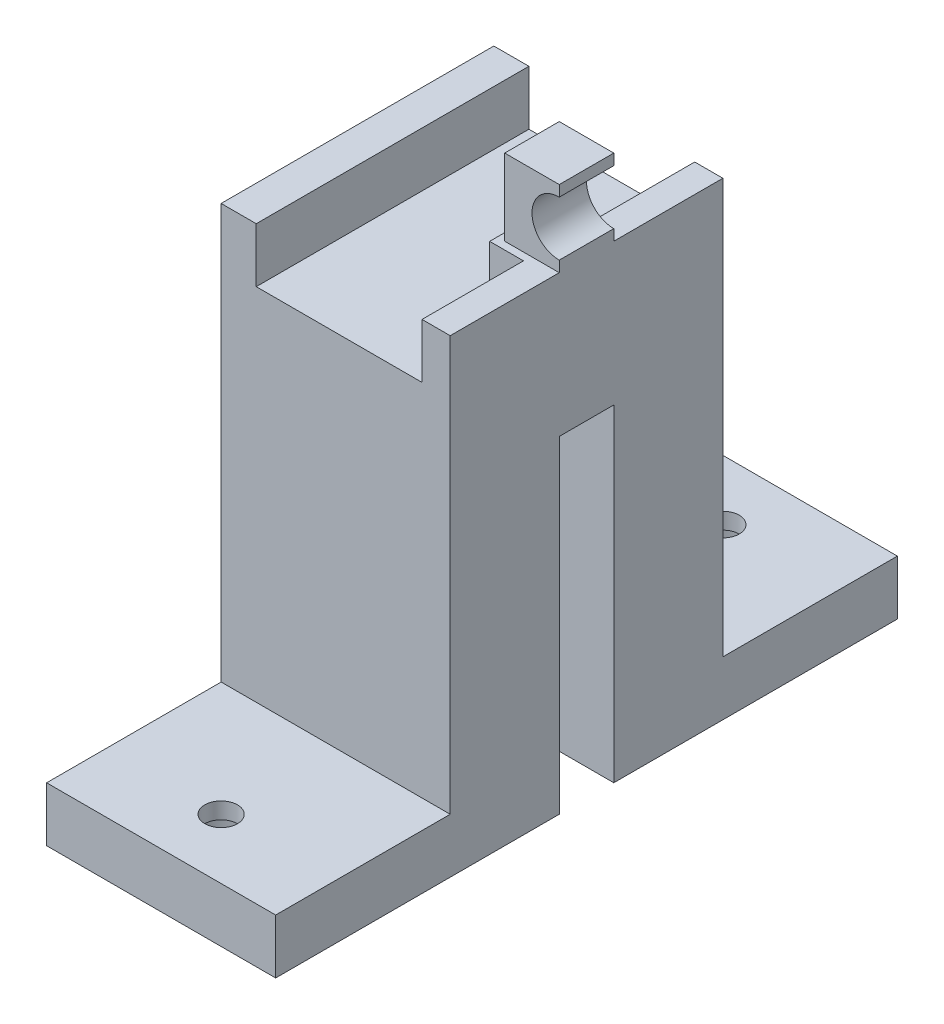
ISO-10303-21;
HEADER;
FILE_DESCRIPTION(('STEP AP214'),'2;1');
FILE_NAME('part.step','',(''),(''),'','','');
FILE_SCHEMA(('AUTOMOTIVE_DESIGN { 1 0 10303 214 1 1 1 1 }'));
ENDSEC;
DATA;
#1=APPLICATION_CONTEXT('core data for automotive mechanical design processes');
#2=APPLICATION_PROTOCOL_DEFINITION('international standard','automotive_design',2000,#1);
#3=PRODUCT_CONTEXT('',#1,'mechanical');
#4=PRODUCT('Part','Part','',(#3));
#5=PRODUCT_RELATED_PRODUCT_CATEGORY('part','',(#4));
#6=PRODUCT_DEFINITION_FORMATION('','',#4);
#7=PRODUCT_DEFINITION_CONTEXT('part definition',#1,'design');
#8=PRODUCT_DEFINITION('design','',#6,#7);
#9=PRODUCT_DEFINITION_SHAPE('','',#8);
#10=(LENGTH_UNIT() NAMED_UNIT(*) SI_UNIT(.MILLI.,.METRE.));
#11=(NAMED_UNIT(*) PLANE_ANGLE_UNIT() SI_UNIT($,.RADIAN.));
#12=(NAMED_UNIT(*) SI_UNIT($,.STERADIAN.) SOLID_ANGLE_UNIT());
#13=UNCERTAINTY_MEASURE_WITH_UNIT(LENGTH_MEASURE(1.E-05),#10,'distance_accuracy_value','');
#14=(GEOMETRIC_REPRESENTATION_CONTEXT(3) GLOBAL_UNCERTAINTY_ASSIGNED_CONTEXT((#13)) GLOBAL_UNIT_ASSIGNED_CONTEXT((#10,
#11,#12)) REPRESENTATION_CONTEXT('',''));
#15=CARTESIAN_POINT('',(0.,0.,0.));
#16=DIRECTION('',(0.,0.,1.));
#17=DIRECTION('',(1.,0.,0.));
#18=AXIS2_PLACEMENT_3D('',#15,#16,#17);
#19=CARTESIAN_POINT('',(-9.,43.,-2.5));
#20=DIRECTION('',(0.,-1.,0.));
#21=DIRECTION('',(0.,0.,-1.));
#22=AXIS2_PLACEMENT_3D('',#19,#20,#21);
#23=PLANE('',#22);
#24=DIRECTION('',(1.,0.,0.));
#25=VECTOR('',#24,1.);
#26=CARTESIAN_POINT('',(0.,43.,12.5));
#27=LINE('',#26,#25);
#28=CARTESIAN_POINT('',(0.,43.,12.5));
#29=VERTEX_POINT('',#28);
#30=CARTESIAN_POINT('',(3.21849819240387,43.,12.5));
#31=VERTEX_POINT('',#30);
#32=EDGE_CURVE('E353',#29,#31,#27,.T.);
#33=ORIENTED_EDGE('',*,*,#32,.T.);
#34=DIRECTION('',(0.,0.,1.));
#35=VECTOR('',#34,1.);
#36=CARTESIAN_POINT('',(3.21849819240387,43.,-12.5));
#37=LINE('',#36,#35);
#38=CARTESIAN_POINT('',(3.21849819240387,43.,-12.5));
#39=VERTEX_POINT('',#38);
#40=EDGE_CURVE('E525',#39,#31,#37,.T.);
#41=ORIENTED_EDGE('',*,*,#40,.F.);
#42=DIRECTION('',(1.,0.,0.));
#43=VECTOR('',#42,1.);
#44=CARTESIAN_POINT('',(0.,43.,-12.5));
#45=LINE('',#44,#43);
#46=CARTESIAN_POINT('',(0.,43.,-12.5));
#47=VERTEX_POINT('',#46);
#48=EDGE_CURVE('E349',#47,#39,#45,.T.);
#49=ORIENTED_EDGE('',*,*,#48,.F.);
#50=DIRECTION('',(0.,0.,1.));
#51=VECTOR('',#50,1.);
#52=CARTESIAN_POINT('',(0.,43.,8.5));
#53=LINE('',#52,#51);
#54=EDGE_CURVE('E385',#47,#29,#53,.T.);
#55=ORIENTED_EDGE('',*,*,#54,.T.);
#56=EDGE_LOOP('',(#33,#41,#49,#55));
#57=FACE_BOUND('',#56,.T.);
#58=ADVANCED_FACE('F59',(#57),#23,.F.);
#59=CARTESIAN_POINT('',(10.5,-10.,23.));
#60=DIRECTION('',(0.,1.,0.));
#61=DIRECTION('',(0.,0.,1.));
#62=AXIS2_PLACEMENT_3D('',#59,#60,#61);
#63=CYLINDRICAL_SURFACE('',#62,1.5);
#64=CARTESIAN_POINT('',(10.5,5.,23.));
#65=DIRECTION('',(0.,-1.,0.));
#66=DIRECTION('',(0.,0.,-1.));
#67=AXIS2_PLACEMENT_3D('',#64,#65,#66);
#68=CIRCLE('',#67,1.5);
#69=CARTESIAN_POINT('',(10.5,5.,21.5));
#70=VERTEX_POINT('',#69);
#71=EDGE_CURVE('E292',#70,#70,#68,.T.);
#72=ORIENTED_EDGE('',*,*,#71,.F.);
#73=EDGE_LOOP('',(#72));
#74=FACE_BOUND('',#73,.T.);
#75=CARTESIAN_POINT('',(10.5,3.5,23.));
#76=DIRECTION('',(0.,-1.,0.));
#77=DIRECTION('',(0.,0.,-1.));
#78=AXIS2_PLACEMENT_3D('',#75,#76,#77);
#79=CIRCLE('',#78,1.5);
#80=CARTESIAN_POINT('',(10.5,3.5,21.5));
#81=VERTEX_POINT('',#80);
#82=EDGE_CURVE('E63',#81,#81,#79,.T.);
#83=ORIENTED_EDGE('',*,*,#82,.T.);
#84=EDGE_LOOP('',(#83));
#85=FACE_BOUND('',#84,.T.);
#86=ADVANCED_FACE('F479',(#74,#85),#63,.F.);
#87=CARTESIAN_POINT('',(10.5,5.,-23.));
#88=DIRECTION('',(0.,-1.,0.));
#89=DIRECTION('',(0.,0.,-1.));
#90=AXIS2_PLACEMENT_3D('',#87,#88,#89);
#91=CYLINDRICAL_SURFACE('',#90,1.5);
#92=CARTESIAN_POINT('',(10.5,5.,-23.));
#93=DIRECTION('',(0.,-1.,0.));
#94=DIRECTION('',(0.,0.,-1.));
#95=AXIS2_PLACEMENT_3D('',#92,#93,#94);
#96=CIRCLE('',#95,1.5);
#97=CARTESIAN_POINT('',(10.5,5.,-24.5));
#98=VERTEX_POINT('',#97);
#99=EDGE_CURVE('E302',#98,#98,#96,.T.);
#100=ORIENTED_EDGE('',*,*,#99,.F.);
#101=EDGE_LOOP('',(#100));
#102=FACE_BOUND('',#101,.T.);
#103=CARTESIAN_POINT('',(10.5,3.5,-23.));
#104=DIRECTION('',(0.,-1.,0.));
#105=DIRECTION('',(0.,0.,-1.));
#106=AXIS2_PLACEMENT_3D('',#103,#104,#105);
#107=CIRCLE('',#106,1.5);
#108=CARTESIAN_POINT('',(10.5,3.5,-24.5));
#109=VERTEX_POINT('',#108);
#110=EDGE_CURVE('E299',#109,#109,#107,.F.);
#111=ORIENTED_EDGE('',*,*,#110,.F.);
#112=EDGE_LOOP('',(#111));
#113=FACE_BOUND('',#112,.T.);
#114=ADVANCED_FACE('F476',(#102,#113),#91,.F.);
#115=CARTESIAN_POINT('',(0.,43.,-12.5));
#116=DIRECTION('',(0.,0.,-1.));
#117=DIRECTION('',(-1.,0.,0.));
#118=AXIS2_PLACEMENT_3D('',#115,#116,#117);
#119=PLANE('',#118);
#120=DIRECTION('',(0.,1.,0.));
#121=VECTOR('',#120,1.);
#122=CARTESIAN_POINT('',(3.21849819240387,38.,-12.5));
#123=LINE('',#122,#121);
#124=CARTESIAN_POINT('',(3.21849819240387,38.,-12.5));
#125=VERTEX_POINT('',#124);
#126=EDGE_CURVE('E538',#125,#39,#123,.T.);
#127=ORIENTED_EDGE('',*,*,#126,.F.);
#128=DIRECTION('',(1.,0.,0.));
#129=VECTOR('',#128,1.);
#130=CARTESIAN_POINT('',(3.21849819240387,38.,-12.5));
#131=LINE('',#130,#129);
#132=CARTESIAN_POINT('',(18.4184981924039,38.,-12.5));
#133=VERTEX_POINT('',#132);
#134=EDGE_CURVE('E576',#125,#133,#131,.T.);
#135=ORIENTED_EDGE('',*,*,#134,.T.);
#136=DIRECTION('',(0.,1.,0.));
#137=VECTOR('',#136,1.);
#138=CARTESIAN_POINT('',(18.4184981924039,38.,-12.5));
#139=LINE('',#138,#137);
#140=CARTESIAN_POINT('',(18.4184981924039,43.,-12.5));
#141=VERTEX_POINT('',#140);
#142=EDGE_CURVE('E534',#133,#141,#139,.T.);
#143=ORIENTED_EDGE('',*,*,#142,.T.);
#144=CARTESIAN_POINT('',(21.,43.,-12.5));
#145=VERTEX_POINT('',#144);
#146=EDGE_CURVE('E346',#141,#145,#45,.T.);
#147=ORIENTED_EDGE('',*,*,#146,.T.);
#148=DIRECTION('',(0.,-1.,0.));
#149=VECTOR('',#148,1.);
#150=CARTESIAN_POINT('',(21.,43.,-12.5));
#151=LINE('',#150,#149);
#152=CARTESIAN_POINT('',(21.,5.,-12.5));
#153=VERTEX_POINT('',#152);
#154=EDGE_CURVE('E342',#145,#153,#151,.T.);
#155=ORIENTED_EDGE('',*,*,#154,.T.);
#156=DIRECTION('',(-1.,0.,0.));
#157=VECTOR('',#156,1.);
#158=CARTESIAN_POINT('',(21.,5.,-12.5));
#159=LINE('',#158,#157);
#160=CARTESIAN_POINT('',(0.,5.,-12.5));
#161=VERTEX_POINT('',#160);
#162=EDGE_CURVE('E320',#153,#161,#159,.T.);
#163=ORIENTED_EDGE('',*,*,#162,.T.);
#164=DIRECTION('',(0.,-1.,0.));
#165=VECTOR('',#164,1.);
#166=CARTESIAN_POINT('',(0.,43.,-12.5));
#167=LINE('',#166,#165);
#168=EDGE_CURVE('E343',#47,#161,#167,.T.);
#169=ORIENTED_EDGE('',*,*,#168,.F.);
#170=ORIENTED_EDGE('',*,*,#48,.T.);
#171=EDGE_LOOP('',(#127,#135,#143,#147,#155,#163,#169,#170));
#172=FACE_BOUND('',#171,.T.);
#173=ADVANCED_FACE('F478',(#172),#119,.T.);
#174=CARTESIAN_POINT('',(0.,43.,12.5));
#175=DIRECTION('',(0.,0.,-1.));
#176=DIRECTION('',(-1.,0.,0.));
#177=AXIS2_PLACEMENT_3D('',#174,#175,#176);
#178=PLANE('',#177);
#179=CARTESIAN_POINT('',(18.4184981924039,43.,12.5));
#180=VERTEX_POINT('',#179);
#181=CARTESIAN_POINT('',(21.,43.,12.5));
#182=VERTEX_POINT('',#181);
#183=EDGE_CURVE('E352',#180,#182,#27,.T.);
#184=ORIENTED_EDGE('',*,*,#183,.F.);
#185=DIRECTION('',(0.,1.,0.));
#186=VECTOR('',#185,1.);
#187=CARTESIAN_POINT('',(18.4184981924039,38.,12.5));
#188=LINE('',#187,#186);
#189=CARTESIAN_POINT('',(18.4184981924039,38.,12.5));
#190=VERTEX_POINT('',#189);
#191=EDGE_CURVE('E543',#190,#180,#188,.T.);
#192=ORIENTED_EDGE('',*,*,#191,.F.);
#193=DIRECTION('',(1.,0.,0.));
#194=VECTOR('',#193,1.);
#195=CARTESIAN_POINT('',(3.21849819240387,38.,12.5));
#196=LINE('',#195,#194);
#197=CARTESIAN_POINT('',(3.21849819240387,38.,12.5));
#198=VERTEX_POINT('',#197);
#199=EDGE_CURVE('E552',#198,#190,#196,.T.);
#200=ORIENTED_EDGE('',*,*,#199,.F.);
#201=DIRECTION('',(0.,1.,0.));
#202=VECTOR('',#201,1.);
#203=CARTESIAN_POINT('',(3.21849819240387,38.,12.5));
#204=LINE('',#203,#202);
#205=EDGE_CURVE('E540',#198,#31,#204,.T.);
#206=ORIENTED_EDGE('',*,*,#205,.T.);
#207=ORIENTED_EDGE('',*,*,#32,.F.);
#208=DIRECTION('',(0.,-1.,0.));
#209=VECTOR('',#208,1.);
#210=CARTESIAN_POINT('',(0.,43.,12.5));
#211=LINE('',#210,#209);
#212=CARTESIAN_POINT('',(0.,5.,12.5));
#213=VERTEX_POINT('',#212);
#214=EDGE_CURVE('E359',#29,#213,#211,.T.);
#215=ORIENTED_EDGE('',*,*,#214,.T.);
#216=DIRECTION('',(-1.,0.,0.));
#217=VECTOR('',#216,1.);
#218=CARTESIAN_POINT('',(21.,5.,12.5));
#219=LINE('',#218,#217);
#220=CARTESIAN_POINT('',(21.,5.,12.5));
#221=VERTEX_POINT('',#220);
#222=EDGE_CURVE('E327',#221,#213,#219,.T.);
#223=ORIENTED_EDGE('',*,*,#222,.F.);
#224=DIRECTION('',(0.,-1.,0.));
#225=VECTOR('',#224,1.);
#226=CARTESIAN_POINT('',(21.,43.,12.5));
#227=LINE('',#226,#225);
#228=EDGE_CURVE('E356',#182,#221,#227,.T.);
#229=ORIENTED_EDGE('',*,*,#228,.F.);
#230=EDGE_LOOP('',(#184,#192,#200,#206,#207,#215,#223,#229));
#231=FACE_BOUND('',#230,.T.);
#232=ADVANCED_FACE('F486',(#231),#178,.F.);
#233=CARTESIAN_POINT('',(21.,50.,-8.5));
#234=DIRECTION('',(1.,0.,0.));
#235=DIRECTION('',(0.,0.,-1.));
#236=AXIS2_PLACEMENT_3D('',#233,#234,#235);
#237=PLANE('',#236);
#238=DIRECTION('',(0.,0.,-1.));
#239=VECTOR('',#238,1.);
#240=CARTESIAN_POINT('',(21.,43.,2.5));
#241=LINE('',#240,#239);
#242=CARTESIAN_POINT('',(21.,43.,2.5));
#243=VERTEX_POINT('',#242);
#244=EDGE_CURVE('E372',#182,#243,#241,.T.);
#245=ORIENTED_EDGE('',*,*,#244,.F.);
#246=ORIENTED_EDGE('',*,*,#228,.T.);
#247=DIRECTION('',(0.,0.,-1.));
#248=VECTOR('',#247,1.);
#249=CARTESIAN_POINT('',(21.,5.,28.5));
#250=LINE('',#249,#248);
#251=CARTESIAN_POINT('',(21.,5.,28.5));
#252=VERTEX_POINT('',#251);
#253=EDGE_CURVE('E324',#252,#221,#250,.T.);
#254=ORIENTED_EDGE('',*,*,#253,.F.);
#255=DIRECTION('',(0.,-1.,0.));
#256=VECTOR('',#255,1.);
#257=CARTESIAN_POINT('',(21.,5.,28.5));
#258=LINE('',#257,#256);
#259=CARTESIAN_POINT('',(21.,0.,28.5));
#260=VERTEX_POINT('',#259);
#261=EDGE_CURVE('E334',#252,#260,#258,.T.);
#262=ORIENTED_EDGE('',*,*,#261,.T.);
#263=DIRECTION('',(0.,0.,1.));
#264=VECTOR('',#263,1.);
#265=CARTESIAN_POINT('',(21.,0.,-8.5));
#266=LINE('',#265,#264);
#267=CARTESIAN_POINT('',(21.,0.,2.5));
#268=VERTEX_POINT('',#267);
#269=EDGE_CURVE('E449',#268,#260,#266,.T.);
#270=ORIENTED_EDGE('',*,*,#269,.F.);
#271=DIRECTION('',(0.,1.,0.));
#272=VECTOR('',#271,1.);
#273=CARTESIAN_POINT('',(21.,-73.0368057899577,2.5));
#274=LINE('',#273,#272);
#275=CARTESIAN_POINT('',(21.,30.,2.5));
#276=VERTEX_POINT('',#275);
#277=EDGE_CURVE('E399',#268,#276,#274,.T.);
#278=ORIENTED_EDGE('',*,*,#277,.T.);
#279=DIRECTION('',(0.,0.,1.));
#280=VECTOR('',#279,1.);
#281=CARTESIAN_POINT('',(21.,30.,-8.5));
#282=LINE('',#281,#280);
#283=CARTESIAN_POINT('',(21.,30.,-2.5));
#284=VERTEX_POINT('',#283);
#285=EDGE_CURVE('E395',#284,#276,#282,.T.);
#286=ORIENTED_EDGE('',*,*,#285,.F.);
#287=DIRECTION('',(0.,1.,0.));
#288=VECTOR('',#287,1.);
#289=CARTESIAN_POINT('',(21.,-73.0368057899577,-2.5));
#290=LINE('',#289,#288);
#291=CARTESIAN_POINT('',(21.,0.,-2.5));
#292=VERTEX_POINT('',#291);
#293=EDGE_CURVE('E412',#292,#284,#290,.T.);
#294=ORIENTED_EDGE('',*,*,#293,.F.);
#295=CARTESIAN_POINT('',(21.,0.,-28.5));
#296=VERTEX_POINT('',#295);
#297=EDGE_CURVE('E461',#296,#292,#266,.T.);
#298=ORIENTED_EDGE('',*,*,#297,.F.);
#299=DIRECTION('',(0.,-1.,0.));
#300=VECTOR('',#299,1.);
#301=CARTESIAN_POINT('',(21.,5.,-28.5));
#302=LINE('',#301,#300);
#303=CARTESIAN_POINT('',(21.,5.,-28.5));
#304=VERTEX_POINT('',#303);
#305=EDGE_CURVE('E305',#304,#296,#302,.T.);
#306=ORIENTED_EDGE('',*,*,#305,.F.);
#307=DIRECTION('',(0.,0.,1.));
#308=VECTOR('',#307,1.);
#309=CARTESIAN_POINT('',(21.,5.,-28.5));
#310=LINE('',#309,#308);
#311=EDGE_CURVE('E316',#304,#153,#310,.T.);
#312=ORIENTED_EDGE('',*,*,#311,.T.);
#313=ORIENTED_EDGE('',*,*,#154,.F.);
#314=DIRECTION('',(0.,0.,-1.));
#315=VECTOR('',#314,1.);
#316=CARTESIAN_POINT('',(21.,43.,-2.5));
#317=LINE('',#316,#315);
#318=CARTESIAN_POINT('',(21.,43.,-2.5));
#319=VERTEX_POINT('',#318);
#320=EDGE_CURVE('E378',#319,#145,#317,.T.);
#321=ORIENTED_EDGE('',*,*,#320,.F.);
#322=DIRECTION('',(0.,-1.,0.));
#323=VECTOR('',#322,1.);
#324=CARTESIAN_POINT('',(21.,50.,-2.5));
#325=LINE('',#324,#323);
#326=CARTESIAN_POINT('',(21.,44.,-2.5));
#327=VERTEX_POINT('',#326);
#328=EDGE_CURVE('E379',#327,#319,#325,.T.);
#329=ORIENTED_EDGE('',*,*,#328,.F.);
#330=DIRECTION('',(0.,0.,-1.));
#331=VECTOR('',#330,1.);
#332=CARTESIAN_POINT('',(21.,44.,27.5));
#333=LINE('',#332,#331);
#334=CARTESIAN_POINT('',(21.,44.,2.5));
#335=VERTEX_POINT('',#334);
#336=EDGE_CURVE('E12',#335,#327,#333,.T.);
#337=ORIENTED_EDGE('',*,*,#336,.F.);
#338=DIRECTION('',(0.,1.,0.));
#339=VECTOR('',#338,1.);
#340=CARTESIAN_POINT('',(21.,50.,2.5));
#341=LINE('',#340,#339);
#342=EDGE_CURVE('E388',#243,#335,#341,.T.);
#343=ORIENTED_EDGE('',*,*,#342,.F.);
#344=EDGE_LOOP('',(#245,#246,#254,#262,#270,#278,#286,#294,#298,#306,#312,#313,#321,#329,#337,#343));
#345=FACE_BOUND('',#344,.T.);
#346=ADVANCED_FACE('F513',(#345),#237,.T.);
#347=CARTESIAN_POINT('',(0.,0.,0.));
#348=DIRECTION('',(0.,-1.,0.));
#349=DIRECTION('',(0.,0.,-1.));
#350=AXIS2_PLACEMENT_3D('',#347,#348,#349);
#351=PLANE('',#350);
#352=CARTESIAN_POINT('',(10.5,0.,23.));
#353=DIRECTION('',(0.,-1.,0.));
#354=DIRECTION('',(0.,0.,-1.));
#355=AXIS2_PLACEMENT_3D('',#352,#353,#354);
#356=CIRCLE('',#355,3.5);
#357=CARTESIAN_POINT('',(10.5,0.,19.5));
#358=VERTEX_POINT('',#357);
#359=EDGE_CURVE('E280',#358,#358,#356,.T.);
#360=ORIENTED_EDGE('',*,*,#359,.F.);
#361=EDGE_LOOP('',(#360));
#362=FACE_BOUND('',#361,.T.);
#363=CARTESIAN_POINT('',(10.5,0.,-23.));
#364=DIRECTION('',(0.,-1.,0.));
#365=DIRECTION('',(0.,0.,-1.));
#366=AXIS2_PLACEMENT_3D('',#363,#364,#365);
#367=CIRCLE('',#366,3.5);
#368=CARTESIAN_POINT('',(10.5,0.,-26.5));
#369=VERTEX_POINT('',#368);
#370=EDGE_CURVE('E295',#369,#369,#367,.T.);
#371=ORIENTED_EDGE('',*,*,#370,.F.);
#372=EDGE_LOOP('',(#371));
#373=FACE_BOUND('',#372,.T.);
#374=ORIENTED_EDGE('',*,*,#269,.T.);
#375=DIRECTION('',(1.,0.,0.));
#376=VECTOR('',#375,1.);
#377=CARTESIAN_POINT('',(0.,0.,28.5));
#378=LINE('',#377,#376);
#379=CARTESIAN_POINT('',(0.,0.,28.5));
#380=VERTEX_POINT('',#379);
#381=EDGE_CURVE('E315',#380,#260,#378,.T.);
#382=ORIENTED_EDGE('',*,*,#381,.F.);
#383=DIRECTION('',(0.,0.,-1.));
#384=VECTOR('',#383,1.);
#385=CARTESIAN_POINT('',(0.,0.,-1.));
#386=LINE('',#385,#384);
#387=CARTESIAN_POINT('',(0.,0.,-28.5));
#388=VERTEX_POINT('',#387);
#389=EDGE_CURVE('E460',#380,#388,#386,.T.);
#390=ORIENTED_EDGE('',*,*,#389,.T.);
#391=DIRECTION('',(1.,0.,0.));
#392=VECTOR('',#391,1.);
#393=CARTESIAN_POINT('',(0.,0.,-28.5));
#394=LINE('',#393,#392);
#395=EDGE_CURVE('E312',#388,#296,#394,.T.);
#396=ORIENTED_EDGE('',*,*,#395,.T.);
#397=ORIENTED_EDGE('',*,*,#297,.T.);
#398=DIRECTION('',(1.,0.,0.));
#399=VECTOR('',#398,1.);
#400=CARTESIAN_POINT('',(21.,0.,-2.5));
#401=LINE('',#400,#399);
#402=CARTESIAN_POINT('',(14.,0.,-2.5));
#403=VERTEX_POINT('',#402);
#404=EDGE_CURVE('E402',#403,#292,#401,.T.);
#405=ORIENTED_EDGE('',*,*,#404,.F.);
#406=DIRECTION('',(0.,0.,-1.));
#407=VECTOR('',#406,1.);
#408=CARTESIAN_POINT('',(14.,0.,2.5));
#409=LINE('',#408,#407);
#410=CARTESIAN_POINT('',(14.,0.,2.5));
#411=VERTEX_POINT('',#410);
#412=EDGE_CURVE('E398',#411,#403,#409,.T.);
#413=ORIENTED_EDGE('',*,*,#412,.F.);
#414=DIRECTION('',(-1.,0.,0.));
#415=VECTOR('',#414,1.);
#416=CARTESIAN_POINT('',(21.,0.,2.5));
#417=LINE('',#416,#415);
#418=EDGE_CURVE('E396',#268,#411,#417,.T.);
#419=ORIENTED_EDGE('',*,*,#418,.F.);
#420=EDGE_LOOP('',(#374,#382,#390,#396,#397,#405,#413,#419));
#421=FACE_BOUND('',#420,.T.);
#422=DIRECTION('',(0.,0.,1.));
#423=VECTOR('',#422,1.);
#424=CARTESIAN_POINT('',(11.,0.,3.5));
#425=LINE('',#424,#423);
#426=CARTESIAN_POINT('',(11.,0.,-3.5));
#427=VERTEX_POINT('',#426);
#428=CARTESIAN_POINT('',(11.,0.,3.5));
#429=VERTEX_POINT('',#428);
#430=EDGE_CURVE('E405',#427,#429,#425,.T.);
#431=ORIENTED_EDGE('',*,*,#430,.F.);
#432=DIRECTION('',(1.,0.,0.));
#433=VECTOR('',#432,1.);
#434=CARTESIAN_POINT('',(3.,0.,-3.5));
#435=LINE('',#434,#433);
#436=CARTESIAN_POINT('',(3.,0.,-3.5));
#437=VERTEX_POINT('',#436);
#438=EDGE_CURVE('E428',#437,#427,#435,.T.);
#439=ORIENTED_EDGE('',*,*,#438,.F.);
#440=DIRECTION('',(0.,0.,-1.));
#441=VECTOR('',#440,1.);
#442=CARTESIAN_POINT('',(3.,0.,-3.5));
#443=LINE('',#442,#441);
#444=CARTESIAN_POINT('',(3.,0.,3.5));
#445=VERTEX_POINT('',#444);
#446=EDGE_CURVE('E442',#445,#437,#443,.T.);
#447=ORIENTED_EDGE('',*,*,#446,.F.);
#448=DIRECTION('',(-1.,0.,0.));
#449=VECTOR('',#448,1.);
#450=CARTESIAN_POINT('',(3.,0.,3.5));
#451=LINE('',#450,#449);
#452=EDGE_CURVE('E439',#429,#445,#451,.T.);
#453=ORIENTED_EDGE('',*,*,#452,.F.);
#454=EDGE_LOOP('',(#431,#439,#447,#453));
#455=FACE_BOUND('',#454,.T.);
#456=ADVANCED_FACE('F504',(#362,#373,#421,#455),#351,.T.);
#457=DIRECTION('',(-1.,0.,0.));
#458=VECTOR('',#457,1.);
#459=CARTESIAN_POINT('',(18.4184981924039,43.,3.2));
#460=LINE('',#459,#458);
#461=CARTESIAN_POINT('',(18.4184981924039,43.,3.2));
#462=VERTEX_POINT('',#461);
#463=CARTESIAN_POINT('',(15.3184981924039,43.,3.2));
#464=VERTEX_POINT('',#463);
#465=EDGE_CURVE('E519',#462,#464,#460,.T.);
#466=ORIENTED_EDGE('',*,*,#465,.F.);
#467=DIRECTION('',(0.,0.,-1.));
#468=VECTOR('',#467,1.);
#469=CARTESIAN_POINT('',(18.4184981924039,43.,12.5));
#470=LINE('',#469,#468);
#471=EDGE_CURVE('E521',#180,#462,#470,.T.);
#472=ORIENTED_EDGE('',*,*,#471,.F.);
#473=ORIENTED_EDGE('',*,*,#183,.T.);
#474=ORIENTED_EDGE('',*,*,#244,.T.);
#475=DIRECTION('',(1.,0.,0.));
#476=VECTOR('',#475,1.);
#477=CARTESIAN_POINT('',(-9.,43.,2.5));
#478=LINE('',#477,#476);
#479=CARTESIAN_POINT('',(16.,43.,2.50000000000001));
#480=VERTEX_POINT('',#479);
#481=EDGE_CURVE('E391',#480,#243,#478,.T.);
#482=ORIENTED_EDGE('',*,*,#481,.F.);
#483=DIRECTION('',(0.,0.,1.));
#484=VECTOR('',#483,1.);
#485=CARTESIAN_POINT('',(16.,43.,-27.5));
#486=LINE('',#485,#484);
#487=CARTESIAN_POINT('',(16.,43.,-2.5));
#488=VERTEX_POINT('',#487);
#489=EDGE_CURVE('E370',#488,#480,#486,.T.);
#490=ORIENTED_EDGE('',*,*,#489,.F.);
#491=DIRECTION('',(1.,0.,0.));
#492=VECTOR('',#491,1.);
#493=CARTESIAN_POINT('',(-9.,43.,-2.5));
#494=LINE('',#493,#492);
#495=EDGE_CURVE('E382',#488,#319,#494,.T.);
#496=ORIENTED_EDGE('',*,*,#495,.T.);
#497=ORIENTED_EDGE('',*,*,#320,.T.);
#498=ORIENTED_EDGE('',*,*,#146,.F.);
#499=DIRECTION('',(0.,0.,1.));
#500=VECTOR('',#499,1.);
#501=CARTESIAN_POINT('',(18.4184981924039,43.,-12.5));
#502=LINE('',#501,#500);
#503=CARTESIAN_POINT('',(18.4184981924039,43.,-3.2));
#504=VERTEX_POINT('',#503);
#505=EDGE_CURVE('E275',#141,#504,#502,.T.);
#506=ORIENTED_EDGE('',*,*,#505,.T.);
#507=DIRECTION('',(-1.,0.,0.));
#508=VECTOR('',#507,1.);
#509=CARTESIAN_POINT('',(18.4184981924039,43.,-3.2));
#510=LINE('',#509,#508);
#511=CARTESIAN_POINT('',(15.3184981924039,43.,-3.2));
#512=VERTEX_POINT('',#511);
#513=EDGE_CURVE('E76',#504,#512,#510,.T.);
#514=ORIENTED_EDGE('',*,*,#513,.T.);
#515=DIRECTION('',(0.,0.,1.));
#516=VECTOR('',#515,1.);
#517=CARTESIAN_POINT('',(15.3184981924039,43.,-3.2));
#518=LINE('',#517,#516);
#519=EDGE_CURVE('E279',#512,#464,#518,.T.);
#520=ORIENTED_EDGE('',*,*,#519,.T.);
#521=EDGE_LOOP('',(#466,#472,#473,#474,#482,#490,#496,#497,#498,#506,#514,#520));
#522=FACE_BOUND('',#521,.T.);
#523=ADVANCED_FACE('F497',(#522),#23,.F.);
#524=CARTESIAN_POINT('',(0.,50.,0.));
#525=DIRECTION('',(0.,-1.,0.));
#526=DIRECTION('',(0.,0.,-1.));
#527=AXIS2_PLACEMENT_3D('',#524,#525,#526);
#528=PLANE('',#527);
#529=DIRECTION('',(0.,0.,1.));
#530=VECTOR('',#529,1.);
#531=CARTESIAN_POINT('',(16.,50.,-27.5));
#532=LINE('',#531,#530);
#533=CARTESIAN_POINT('',(16.,50.,-2.5));
#534=VERTEX_POINT('',#533);
#535=CARTESIAN_POINT('',(16.,50.,2.50000000000001));
#536=VERTEX_POINT('',#535);
#537=EDGE_CURVE('E369',#534,#536,#532,.T.);
#538=ORIENTED_EDGE('',*,*,#537,.T.);
#539=DIRECTION('',(1.,0.,0.));
#540=VECTOR('',#539,1.);
#541=CARTESIAN_POINT('',(0.,50.,2.5));
#542=LINE('',#541,#540);
#543=CARTESIAN_POINT('',(21.,50.,2.5));
#544=VERTEX_POINT('',#543);
#545=EDGE_CURVE('E459',#536,#544,#542,.T.);
#546=ORIENTED_EDGE('',*,*,#545,.T.);
#547=DIRECTION('',(0.,0.,1.));
#548=VECTOR('',#547,1.);
#549=CARTESIAN_POINT('',(21.,50.,-8.5));
#550=LINE('',#549,#548);
#551=CARTESIAN_POINT('',(21.,50.,-2.5));
#552=VERTEX_POINT('',#551);
#553=EDGE_CURVE('E456',#552,#544,#550,.T.);
#554=ORIENTED_EDGE('',*,*,#553,.F.);
#555=DIRECTION('',(-1.,0.,0.));
#556=VECTOR('',#555,1.);
#557=CARTESIAN_POINT('',(0.,50.,-2.5));
#558=LINE('',#557,#556);
#559=EDGE_CURVE('E466',#552,#534,#558,.T.);
#560=ORIENTED_EDGE('',*,*,#559,.T.);
#561=EDGE_LOOP('',(#538,#546,#554,#560));
#562=FACE_BOUND('',#561,.T.);
#563=ADVANCED_FACE('F503',(#562),#528,.F.);
#564=CARTESIAN_POINT('',(-9.,50.,2.5));
#565=DIRECTION('',(0.,0.,-1.));
#566=DIRECTION('',(0.,1.,0.));
#567=AXIS2_PLACEMENT_3D('',#564,#565,#566);
#568=PLANE('',#567);
#569=ORIENTED_EDGE('',*,*,#342,.T.);
#570=CARTESIAN_POINT('',(21.,46.5,2.5));
#571=DIRECTION('',(0.,0.,-1.));
#572=DIRECTION('',(0.,1.,0.));
#573=AXIS2_PLACEMENT_3D('',#570,#571,#572);
#574=CIRCLE('',#573,2.5);
#575=CARTESIAN_POINT('',(21.,49.,2.5));
#576=VERTEX_POINT('',#575);
#577=EDGE_CURVE('E363',#335,#576,#574,.T.);
#578=ORIENTED_EDGE('',*,*,#577,.T.);
#579=EDGE_CURVE('E387',#576,#544,#341,.T.);
#580=ORIENTED_EDGE('',*,*,#579,.T.);
#581=ORIENTED_EDGE('',*,*,#545,.F.);
#582=DIRECTION('',(0.,-1.,0.));
#583=VECTOR('',#582,1.);
#584=CARTESIAN_POINT('',(16.,0.,2.50000000000001));
#585=LINE('',#584,#583);
#586=EDGE_CURVE('E366',#536,#480,#585,.T.);
#587=ORIENTED_EDGE('',*,*,#586,.T.);
#588=ORIENTED_EDGE('',*,*,#481,.T.);
#589=EDGE_LOOP('',(#569,#578,#580,#581,#587,#588));
#590=FACE_BOUND('',#589,.T.);
#591=ADVANCED_FACE('F510',(#590),#568,.F.);
#592=CARTESIAN_POINT('',(-9.,50.,-2.5));
#593=DIRECTION('',(0.,0.,1.));
#594=DIRECTION('',(0.,-1.,0.));
#595=AXIS2_PLACEMENT_3D('',#592,#593,#594);
#596=PLANE('',#595);
#597=CARTESIAN_POINT('',(21.,49.,-2.5));
#598=VERTEX_POINT('',#597);
#599=EDGE_CURVE('E375',#552,#598,#325,.T.);
#600=ORIENTED_EDGE('',*,*,#599,.T.);
#601=CARTESIAN_POINT('',(21.,46.5,-2.5));
#602=DIRECTION('',(0.,0.,-1.));
#603=DIRECTION('',(0.,1.,0.));
#604=AXIS2_PLACEMENT_3D('',#601,#602,#603);
#605=CIRCLE('',#604,2.5);
#606=EDGE_CURVE('E361',#327,#598,#605,.T.);
#607=ORIENTED_EDGE('',*,*,#606,.F.);
#608=ORIENTED_EDGE('',*,*,#328,.T.);
#609=ORIENTED_EDGE('',*,*,#495,.F.);
#610=DIRECTION('',(0.,-1.,0.));
#611=VECTOR('',#610,1.);
#612=CARTESIAN_POINT('',(16.,50.,-2.5));
#613=LINE('',#612,#611);
#614=EDGE_CURVE('E469',#534,#488,#613,.T.);
#615=ORIENTED_EDGE('',*,*,#614,.F.);
#616=ORIENTED_EDGE('',*,*,#559,.F.);
#617=EDGE_LOOP('',(#600,#607,#608,#609,#615,#616));
#618=FACE_BOUND('',#617,.T.);
#619=ADVANCED_FACE('F570',(#618),#596,.F.);
#620=DIRECTION('',(0.,0.,-1.));
#621=VECTOR('',#620,1.);
#622=CARTESIAN_POINT('',(21.,49.,27.5));
#623=LINE('',#622,#621);
#624=EDGE_CURVE('E68',#598,#576,#623,.F.);
#625=ORIENTED_EDGE('',*,*,#624,.F.);
#626=ORIENTED_EDGE('',*,*,#599,.F.);
#627=ORIENTED_EDGE('',*,*,#553,.T.);
#628=ORIENTED_EDGE('',*,*,#579,.F.);
#629=EDGE_LOOP('',(#625,#626,#627,#628));
#630=FACE_BOUND('',#629,.T.);
#631=ADVANCED_FACE('F61',(#630),#237,.T.);
#632=CARTESIAN_POINT('',(0.,50.,-1.));
#633=DIRECTION('',(-1.,0.,0.));
#634=DIRECTION('',(0.,0.,1.));
#635=AXIS2_PLACEMENT_3D('',#632,#633,#634);
#636=PLANE('',#635);
#637=ORIENTED_EDGE('',*,*,#54,.F.);
#638=ORIENTED_EDGE('',*,*,#168,.T.);
#639=DIRECTION('',(0.,0.,-1.));
#640=VECTOR('',#639,1.);
#641=CARTESIAN_POINT('',(0.,5.,-12.5));
#642=LINE('',#641,#640);
#643=CARTESIAN_POINT('',(0.,5.,-28.5));
#644=VERTEX_POINT('',#643);
#645=EDGE_CURVE('E84',#161,#644,#642,.T.);
#646=ORIENTED_EDGE('',*,*,#645,.T.);
#647=DIRECTION('',(0.,-1.,0.));
#648=VECTOR('',#647,1.);
#649=CARTESIAN_POINT('',(0.,5.,-28.5));
#650=LINE('',#649,#648);
#651=EDGE_CURVE('E306',#644,#388,#650,.T.);
#652=ORIENTED_EDGE('',*,*,#651,.T.);
#653=ORIENTED_EDGE('',*,*,#389,.F.);
#654=DIRECTION('',(0.,-1.,0.));
#655=VECTOR('',#654,1.);
#656=CARTESIAN_POINT('',(0.,5.,28.5));
#657=LINE('',#656,#655);
#658=CARTESIAN_POINT('',(0.,5.,28.5));
#659=VERTEX_POINT('',#658);
#660=EDGE_CURVE('E339',#659,#380,#657,.T.);
#661=ORIENTED_EDGE('',*,*,#660,.F.);
#662=DIRECTION('',(0.,0.,1.));
#663=VECTOR('',#662,1.);
#664=CARTESIAN_POINT('',(0.,5.,12.5));
#665=LINE('',#664,#663);
#666=EDGE_CURVE('E330',#213,#659,#665,.T.);
#667=ORIENTED_EDGE('',*,*,#666,.F.);
#668=ORIENTED_EDGE('',*,*,#214,.F.);
#669=EDGE_LOOP('',(#637,#638,#646,#652,#653,#661,#667,#668));
#670=FACE_BOUND('',#669,.T.);
#671=ADVANCED_FACE('F600',(#670),#636,.T.);
#672=CARTESIAN_POINT('',(11.,31.3896424388864,3.5));
#673=DIRECTION('',(1.,0.,0.));
#674=DIRECTION('',(0.,0.,-1.));
#675=AXIS2_PLACEMENT_3D('',#672,#673,#674);
#676=PLANE('',#675);
#677=ORIENTED_EDGE('',*,*,#430,.T.);
#678=DIRECTION('',(0.,-1.,0.));
#679=VECTOR('',#678,1.);
#680=CARTESIAN_POINT('',(11.,31.3896424388864,3.5));
#681=LINE('',#680,#679);
#682=CARTESIAN_POINT('',(11.,31.3896424388864,3.5));
#683=VERTEX_POINT('',#682);
#684=EDGE_CURVE('E437',#683,#429,#681,.T.);
#685=ORIENTED_EDGE('',*,*,#684,.F.);
#686=DIRECTION('',(0.,0.,1.));
#687=VECTOR('',#686,1.);
#688=CARTESIAN_POINT('',(11.,31.3896424388864,3.5));
#689=LINE('',#688,#687);
#690=CARTESIAN_POINT('',(11.,31.3896424388864,-3.5));
#691=VERTEX_POINT('',#690);
#692=EDGE_CURVE('E424',#691,#683,#689,.T.);
#693=ORIENTED_EDGE('',*,*,#692,.F.);
#694=DIRECTION('',(0.,-1.,0.));
#695=VECTOR('',#694,1.);
#696=CARTESIAN_POINT('',(11.,31.3896424388864,-3.5));
#697=LINE('',#696,#695);
#698=EDGE_CURVE('E447',#691,#427,#697,.T.);
#699=ORIENTED_EDGE('',*,*,#698,.T.);
#700=EDGE_LOOP('',(#677,#685,#693,#699));
#701=FACE_BOUND('',#700,.T.);
#702=ADVANCED_FACE('F667',(#701),#676,.F.);
#703=CARTESIAN_POINT('',(3.,31.3896424388864,-3.5));
#704=DIRECTION('',(0.,0.,-1.));
#705=DIRECTION('',(-1.,0.,0.));
#706=AXIS2_PLACEMENT_3D('',#703,#704,#705);
#707=PLANE('',#706);
#708=ORIENTED_EDGE('',*,*,#438,.T.);
#709=ORIENTED_EDGE('',*,*,#698,.F.);
#710=DIRECTION('',(1.,0.,0.));
#711=VECTOR('',#710,1.);
#712=CARTESIAN_POINT('',(3.,31.3896424388864,-3.5));
#713=LINE('',#712,#711);
#714=CARTESIAN_POINT('',(3.,31.3896424388864,-3.5));
#715=VERTEX_POINT('',#714);
#716=EDGE_CURVE('E434',#715,#691,#713,.T.);
#717=ORIENTED_EDGE('',*,*,#716,.F.);
#718=DIRECTION('',(0.,-1.,0.));
#719=VECTOR('',#718,1.);
#720=CARTESIAN_POINT('',(3.,31.3896424388864,-3.5));
#721=LINE('',#720,#719);
#722=EDGE_CURVE('E450',#715,#437,#721,.T.);
#723=ORIENTED_EDGE('',*,*,#722,.T.);
#724=EDGE_LOOP('',(#708,#709,#717,#723));
#725=FACE_BOUND('',#724,.T.);
#726=ADVANCED_FACE('F835',(#725),#707,.F.);
#727=CARTESIAN_POINT('',(3.,31.3896424388864,-3.5));
#728=DIRECTION('',(-1.,0.,0.));
#729=DIRECTION('',(0.,0.,1.));
#730=AXIS2_PLACEMENT_3D('',#727,#728,#729);
#731=PLANE('',#730);
#732=ORIENTED_EDGE('',*,*,#446,.T.);
#733=ORIENTED_EDGE('',*,*,#722,.F.);
#734=DIRECTION('',(0.,0.,-1.));
#735=VECTOR('',#734,1.);
#736=CARTESIAN_POINT('',(3.,31.3896424388864,-3.5));
#737=LINE('',#736,#735);
#738=CARTESIAN_POINT('',(3.,31.3896424388864,3.5));
#739=VERTEX_POINT('',#738);
#740=EDGE_CURVE('E431',#739,#715,#737,.T.);
#741=ORIENTED_EDGE('',*,*,#740,.F.);
#742=DIRECTION('',(0.,-1.,0.));
#743=VECTOR('',#742,1.);
#744=CARTESIAN_POINT('',(3.,31.3896424388864,3.5));
#745=LINE('',#744,#743);
#746=EDGE_CURVE('E452',#739,#445,#745,.T.);
#747=ORIENTED_EDGE('',*,*,#746,.T.);
#748=EDGE_LOOP('',(#732,#733,#741,#747));
#749=FACE_BOUND('',#748,.T.);
#750=ADVANCED_FACE('F843',(#749),#731,.F.);
#751=CARTESIAN_POINT('',(3.,31.3896424388864,3.5));
#752=DIRECTION('',(0.,0.,1.));
#753=DIRECTION('',(1.,0.,0.));
#754=AXIS2_PLACEMENT_3D('',#751,#752,#753);
#755=PLANE('',#754);
#756=ORIENTED_EDGE('',*,*,#452,.T.);
#757=ORIENTED_EDGE('',*,*,#746,.F.);
#758=DIRECTION('',(-1.,0.,0.));
#759=VECTOR('',#758,1.);
#760=CARTESIAN_POINT('',(3.,31.3896424388864,3.5));
#761=LINE('',#760,#759);
#762=EDGE_CURVE('E427',#683,#739,#761,.T.);
#763=ORIENTED_EDGE('',*,*,#762,.F.);
#764=ORIENTED_EDGE('',*,*,#684,.T.);
#765=EDGE_LOOP('',(#756,#757,#763,#764));
#766=FACE_BOUND('',#765,.T.);
#767=ADVANCED_FACE('F851',(#766),#755,.F.);
#768=CARTESIAN_POINT('',(0.,31.3896424388864,0.));
#769=DIRECTION('',(0.,-1.,0.));
#770=DIRECTION('',(0.,0.,-1.));
#771=AXIS2_PLACEMENT_3D('',#768,#769,#770);
#772=PLANE('',#771);
#773=ORIENTED_EDGE('',*,*,#692,.T.);
#774=ORIENTED_EDGE('',*,*,#762,.T.);
#775=ORIENTED_EDGE('',*,*,#740,.T.);
#776=ORIENTED_EDGE('',*,*,#716,.T.);
#777=EDGE_LOOP('',(#773,#774,#775,#776));
#778=FACE_BOUND('',#777,.T.);
#779=ADVANCED_FACE('F859',(#778),#772,.T.);
#780=CARTESIAN_POINT('',(21.,-73.0368057899577,2.5));
#781=DIRECTION('',(0.,0.,-1.));
#782=DIRECTION('',(-1.,0.,0.));
#783=AXIS2_PLACEMENT_3D('',#780,#781,#782);
#784=PLANE('',#783);
#785=ORIENTED_EDGE('',*,*,#277,.F.);
#786=ORIENTED_EDGE('',*,*,#418,.T.);
#787=DIRECTION('',(0.,1.,0.));
#788=VECTOR('',#787,1.);
#789=CARTESIAN_POINT('',(14.,-73.0368057899577,2.5));
#790=LINE('',#789,#788);
#791=CARTESIAN_POINT('',(14.,30.,2.5));
#792=VERTEX_POINT('',#791);
#793=EDGE_CURVE('E418',#411,#792,#790,.T.);
#794=ORIENTED_EDGE('',*,*,#793,.T.);
#795=DIRECTION('',(-1.,0.,0.));
#796=VECTOR('',#795,1.);
#797=CARTESIAN_POINT('',(21.,30.,2.5));
#798=LINE('',#797,#796);
#799=EDGE_CURVE('E410',#276,#792,#798,.T.);
#800=ORIENTED_EDGE('',*,*,#799,.F.);
#801=EDGE_LOOP('',(#785,#786,#794,#800));
#802=FACE_BOUND('',#801,.T.);
#803=ADVANCED_FACE('F615',(#802),#784,.T.);
#804=CARTESIAN_POINT('',(14.,-73.0368057899577,2.5));
#805=DIRECTION('',(1.,0.,0.));
#806=DIRECTION('',(0.,0.,-1.));
#807=AXIS2_PLACEMENT_3D('',#804,#805,#806);
#808=PLANE('',#807);
#809=ORIENTED_EDGE('',*,*,#793,.F.);
#810=ORIENTED_EDGE('',*,*,#412,.T.);
#811=DIRECTION('',(0.,1.,0.));
#812=VECTOR('',#811,1.);
#813=CARTESIAN_POINT('',(14.,-73.0368057899577,-2.5));
#814=LINE('',#813,#812);
#815=CARTESIAN_POINT('',(14.,30.,-2.5));
#816=VERTEX_POINT('',#815);
#817=EDGE_CURVE('E415',#403,#816,#814,.T.);
#818=ORIENTED_EDGE('',*,*,#817,.T.);
#819=DIRECTION('',(0.,0.,-1.));
#820=VECTOR('',#819,1.);
#821=CARTESIAN_POINT('',(14.,30.,2.5));
#822=LINE('',#821,#820);
#823=EDGE_CURVE('E408',#792,#816,#822,.T.);
#824=ORIENTED_EDGE('',*,*,#823,.F.);
#825=EDGE_LOOP('',(#809,#810,#818,#824));
#826=FACE_BOUND('',#825,.T.);
#827=ADVANCED_FACE('F619',(#826),#808,.T.);
#828=CARTESIAN_POINT('',(21.,-73.0368057899577,-2.5));
#829=DIRECTION('',(0.,0.,1.));
#830=DIRECTION('',(1.,0.,0.));
#831=AXIS2_PLACEMENT_3D('',#828,#829,#830);
#832=PLANE('',#831);
#833=ORIENTED_EDGE('',*,*,#817,.F.);
#834=ORIENTED_EDGE('',*,*,#404,.T.);
#835=ORIENTED_EDGE('',*,*,#293,.T.);
#836=DIRECTION('',(1.,0.,0.));
#837=VECTOR('',#836,1.);
#838=CARTESIAN_POINT('',(21.,30.,-2.5));
#839=LINE('',#838,#837);
#840=EDGE_CURVE('E406',#816,#284,#839,.T.);
#841=ORIENTED_EDGE('',*,*,#840,.F.);
#842=EDGE_LOOP('',(#833,#834,#835,#841));
#843=FACE_BOUND('',#842,.T.);
#844=ADVANCED_FACE('F624',(#843),#832,.T.);
#845=CARTESIAN_POINT('',(0.,30.,0.));
#846=DIRECTION('',(0.,-1.,0.));
#847=DIRECTION('',(0.,0.,-1.));
#848=AXIS2_PLACEMENT_3D('',#845,#846,#847);
#849=PLANE('',#848);
#850=ORIENTED_EDGE('',*,*,#840,.T.);
#851=ORIENTED_EDGE('',*,*,#285,.T.);
#852=ORIENTED_EDGE('',*,*,#799,.T.);
#853=ORIENTED_EDGE('',*,*,#823,.T.);
#854=EDGE_LOOP('',(#850,#851,#852,#853));
#855=FACE_BOUND('',#854,.T.);
#856=ADVANCED_FACE('F622',(#855),#849,.T.);
#857=CARTESIAN_POINT('',(16.,0.,-27.5));
#858=DIRECTION('',(-1.,0.,0.));
#859=DIRECTION('',(0.,-1.,0.));
#860=AXIS2_PLACEMENT_3D('',#857,#858,#859);
#861=PLANE('',#860);
#862=ORIENTED_EDGE('',*,*,#614,.T.);
#863=ORIENTED_EDGE('',*,*,#489,.T.);
#864=ORIENTED_EDGE('',*,*,#586,.F.);
#865=ORIENTED_EDGE('',*,*,#537,.F.);
#866=EDGE_LOOP('',(#862,#863,#864,#865));
#867=FACE_BOUND('',#866,.T.);
#868=ADVANCED_FACE('F651',(#867),#861,.T.);
#869=CARTESIAN_POINT('',(21.,46.5,27.5));
#870=DIRECTION('',(0.,0.,-1.));
#871=DIRECTION('',(0.,1.,0.));
#872=AXIS2_PLACEMENT_3D('',#869,#870,#871);
#873=CYLINDRICAL_SURFACE('',#872,2.5);
#874=ORIENTED_EDGE('',*,*,#336,.T.);
#875=ORIENTED_EDGE('',*,*,#606,.T.);
#876=ORIENTED_EDGE('',*,*,#624,.T.);
#877=ORIENTED_EDGE('',*,*,#577,.F.);
#878=EDGE_LOOP('',(#874,#875,#876,#877));
#879=FACE_BOUND('',#878,.T.);
#880=ADVANCED_FACE('F646',(#879),#873,.F.);
#881=CARTESIAN_POINT('',(0.,5.,28.5));
#882=DIRECTION('',(0.,0.,-1.));
#883=DIRECTION('',(-1.,0.,0.));
#884=AXIS2_PLACEMENT_3D('',#881,#882,#883);
#885=PLANE('',#884);
#886=ORIENTED_EDGE('',*,*,#381,.T.);
#887=ORIENTED_EDGE('',*,*,#261,.F.);
#888=DIRECTION('',(1.,0.,0.));
#889=VECTOR('',#888,1.);
#890=CARTESIAN_POINT('',(0.,5.,28.5));
#891=LINE('',#890,#889);
#892=EDGE_CURVE('E332',#659,#252,#891,.T.);
#893=ORIENTED_EDGE('',*,*,#892,.F.);
#894=ORIENTED_EDGE('',*,*,#660,.T.);
#895=EDGE_LOOP('',(#886,#887,#893,#894));
#896=FACE_BOUND('',#895,.T.);
#897=ADVANCED_FACE('F605',(#896),#885,.F.);
#898=CARTESIAN_POINT('',(0.,5.,0.));
#899=DIRECTION('',(0.,1.,0.));
#900=DIRECTION('',(0.,0.,1.));
#901=AXIS2_PLACEMENT_3D('',#898,#899,#900);
#902=PLANE('',#901);
#903=ORIENTED_EDGE('',*,*,#71,.T.);
#904=EDGE_LOOP('',(#903));
#905=FACE_BOUND('',#904,.T.);
#906=ORIENTED_EDGE('',*,*,#253,.T.);
#907=ORIENTED_EDGE('',*,*,#222,.T.);
#908=ORIENTED_EDGE('',*,*,#666,.T.);
#909=ORIENTED_EDGE('',*,*,#892,.T.);
#910=EDGE_LOOP('',(#906,#907,#908,#909));
#911=FACE_BOUND('',#910,.T.);
#912=ADVANCED_FACE('F598',(#905,#911),#902,.T.);
#913=CARTESIAN_POINT('',(0.,5.,-28.5));
#914=DIRECTION('',(0.,0.,-1.));
#915=DIRECTION('',(-1.,0.,0.));
#916=AXIS2_PLACEMENT_3D('',#913,#914,#915);
#917=PLANE('',#916);
#918=ORIENTED_EDGE('',*,*,#395,.F.);
#919=ORIENTED_EDGE('',*,*,#651,.F.);
#920=DIRECTION('',(1.,0.,0.));
#921=VECTOR('',#920,1.);
#922=CARTESIAN_POINT('',(0.,5.,-28.5));
#923=LINE('',#922,#921);
#924=EDGE_CURVE('E309',#644,#304,#923,.T.);
#925=ORIENTED_EDGE('',*,*,#924,.T.);
#926=ORIENTED_EDGE('',*,*,#305,.T.);
#927=EDGE_LOOP('',(#918,#919,#925,#926));
#928=FACE_BOUND('',#927,.T.);
#929=ADVANCED_FACE('F629',(#928),#917,.T.);
#930=CARTESIAN_POINT('',(0.,5.,0.));
#931=DIRECTION('',(0.,-1.,0.));
#932=DIRECTION('',(0.,0.,-1.));
#933=AXIS2_PLACEMENT_3D('',#930,#931,#932);
#934=PLANE('',#933);
#935=ORIENTED_EDGE('',*,*,#99,.T.);
#936=EDGE_LOOP('',(#935));
#937=FACE_BOUND('',#936,.T.);
#938=ORIENTED_EDGE('',*,*,#311,.F.);
#939=ORIENTED_EDGE('',*,*,#924,.F.);
#940=ORIENTED_EDGE('',*,*,#645,.F.);
#941=ORIENTED_EDGE('',*,*,#162,.F.);
#942=EDGE_LOOP('',(#938,#939,#940,#941));
#943=FACE_BOUND('',#942,.T.);
#944=ADVANCED_FACE('F630',(#937,#943),#934,.F.);
#945=CARTESIAN_POINT('',(10.5,3.5,-23.));
#946=DIRECTION('',(0.,-1.,0.));
#947=DIRECTION('',(0.,0.,-1.));
#948=AXIS2_PLACEMENT_3D('',#945,#946,#947);
#949=PLANE('',#948);
#950=CARTESIAN_POINT('',(10.5,3.5,-23.));
#951=DIRECTION('',(0.,-1.,0.));
#952=DIRECTION('',(0.,0.,-1.));
#953=AXIS2_PLACEMENT_3D('',#950,#951,#952);
#954=CIRCLE('',#953,3.5);
#955=CARTESIAN_POINT('',(10.5,3.5,-26.5));
#956=VERTEX_POINT('',#955);
#957=EDGE_CURVE('E296',#956,#956,#954,.T.);
#958=ORIENTED_EDGE('',*,*,#957,.T.);
#959=EDGE_LOOP('',(#958));
#960=FACE_BOUND('',#959,.T.);
#961=ORIENTED_EDGE('',*,*,#110,.T.);
#962=EDGE_LOOP('',(#961));
#963=FACE_BOUND('',#962,.T.);
#964=ADVANCED_FACE('F474',(#960,#963),#949,.T.);
#965=CARTESIAN_POINT('',(10.5,3.5,-23.));
#966=DIRECTION('',(0.,-1.,0.));
#967=DIRECTION('',(0.,0.,-1.));
#968=AXIS2_PLACEMENT_3D('',#965,#966,#967);
#969=CYLINDRICAL_SURFACE('',#968,3.5);
#970=ORIENTED_EDGE('',*,*,#957,.F.);
#971=EDGE_LOOP('',(#970));
#972=FACE_BOUND('',#971,.T.);
#973=ORIENTED_EDGE('',*,*,#370,.T.);
#974=EDGE_LOOP('',(#973));
#975=FACE_BOUND('',#974,.T.);
#976=ADVANCED_FACE('F638',(#972,#975),#969,.F.);
#977=CARTESIAN_POINT('',(10.5,3.5,23.));
#978=DIRECTION('',(0.,-1.,0.));
#979=DIRECTION('',(0.,0.,-1.));
#980=AXIS2_PLACEMENT_3D('',#977,#978,#979);
#981=CYLINDRICAL_SURFACE('',#980,3.5);
#982=CARTESIAN_POINT('',(10.5,3.5,23.));
#983=DIRECTION('',(0.,-1.,0.));
#984=DIRECTION('',(0.,0.,-1.));
#985=AXIS2_PLACEMENT_3D('',#982,#983,#984);
#986=CIRCLE('',#985,3.5);
#987=CARTESIAN_POINT('',(10.5,3.5,19.5));
#988=VERTEX_POINT('',#987);
#989=EDGE_CURVE('E284',#988,#988,#986,.T.);
#990=ORIENTED_EDGE('',*,*,#989,.F.);
#991=EDGE_LOOP('',(#990));
#992=FACE_BOUND('',#991,.T.);
#993=ORIENTED_EDGE('',*,*,#359,.T.);
#994=EDGE_LOOP('',(#993));
#995=FACE_BOUND('',#994,.T.);
#996=ADVANCED_FACE('F690',(#992,#995),#981,.F.);
#997=CARTESIAN_POINT('',(10.5,3.5,23.));
#998=DIRECTION('',(0.,-1.,0.));
#999=DIRECTION('',(0.,0.,-1.));
#1000=AXIS2_PLACEMENT_3D('',#997,#998,#999);
#1001=PLANE('',#1000);
#1002=ORIENTED_EDGE('',*,*,#82,.F.);
#1003=EDGE_LOOP('',(#1002));
#1004=FACE_BOUND('',#1003,.T.);
#1005=ORIENTED_EDGE('',*,*,#989,.T.);
#1006=EDGE_LOOP('',(#1005));
#1007=FACE_BOUND('',#1006,.T.);
#1008=ADVANCED_FACE('F695',(#1004,#1007),#1001,.T.);
#1009=CARTESIAN_POINT('',(18.4184981924039,38.,-3.2));
#1010=DIRECTION('',(0.,0.,-1.));
#1011=DIRECTION('',(-1.,0.,0.));
#1012=AXIS2_PLACEMENT_3D('',#1009,#1010,#1011);
#1013=PLANE('',#1012);
#1014=ORIENTED_EDGE('',*,*,#513,.F.);
#1015=DIRECTION('',(0.,1.,0.));
#1016=VECTOR('',#1015,1.);
#1017=CARTESIAN_POINT('',(18.4184981924039,38.,-3.2));
#1018=LINE('',#1017,#1016);
#1019=CARTESIAN_POINT('',(18.4184981924039,38.,-3.2));
#1020=VERTEX_POINT('',#1019);
#1021=EDGE_CURVE('E274',#1020,#504,#1018,.T.);
#1022=ORIENTED_EDGE('',*,*,#1021,.F.);
#1023=DIRECTION('',(-1.,0.,0.));
#1024=VECTOR('',#1023,1.);
#1025=CARTESIAN_POINT('',(18.4184981924039,38.,-3.2));
#1026=LINE('',#1025,#1024);
#1027=CARTESIAN_POINT('',(15.3184981924039,38.,-3.2));
#1028=VERTEX_POINT('',#1027);
#1029=EDGE_CURVE('E264',#1020,#1028,#1026,.T.);
#1030=ORIENTED_EDGE('',*,*,#1029,.T.);
#1031=DIRECTION('',(0.,1.,0.));
#1032=VECTOR('',#1031,1.);
#1033=CARTESIAN_POINT('',(15.3184981924039,38.,-3.2));
#1034=LINE('',#1033,#1032);
#1035=EDGE_CURVE('E273',#1028,#512,#1034,.T.);
#1036=ORIENTED_EDGE('',*,*,#1035,.T.);
#1037=EDGE_LOOP('',(#1014,#1022,#1030,#1036));
#1038=FACE_BOUND('',#1037,.T.);
#1039=ADVANCED_FACE('F272',(#1038),#1013,.T.);
#1040=CARTESIAN_POINT('',(15.3184981924039,38.,-3.2));
#1041=DIRECTION('',(-1.,0.,0.));
#1042=DIRECTION('',(0.,0.,1.));
#1043=AXIS2_PLACEMENT_3D('',#1040,#1041,#1042);
#1044=PLANE('',#1043);
#1045=ORIENTED_EDGE('',*,*,#519,.F.);
#1046=ORIENTED_EDGE('',*,*,#1035,.F.);
#1047=DIRECTION('',(0.,0.,1.));
#1048=VECTOR('',#1047,1.);
#1049=CARTESIAN_POINT('',(15.3184981924039,38.,-3.2));
#1050=LINE('',#1049,#1048);
#1051=CARTESIAN_POINT('',(15.3184981924039,38.,3.2));
#1052=VERTEX_POINT('',#1051);
#1053=EDGE_CURVE('E260',#1028,#1052,#1050,.T.);
#1054=ORIENTED_EDGE('',*,*,#1053,.T.);
#1055=DIRECTION('',(0.,1.,0.));
#1056=VECTOR('',#1055,1.);
#1057=CARTESIAN_POINT('',(15.3184981924039,38.,3.2));
#1058=LINE('',#1057,#1056);
#1059=EDGE_CURVE('E281',#1052,#464,#1058,.T.);
#1060=ORIENTED_EDGE('',*,*,#1059,.T.);
#1061=EDGE_LOOP('',(#1045,#1046,#1054,#1060));
#1062=FACE_BOUND('',#1061,.T.);
#1063=ADVANCED_FACE('F277',(#1062),#1044,.T.);
#1064=CARTESIAN_POINT('',(18.4184981924039,38.,3.2));
#1065=DIRECTION('',(0.,0.,-1.));
#1066=DIRECTION('',(-1.,0.,0.));
#1067=AXIS2_PLACEMENT_3D('',#1064,#1065,#1066);
#1068=PLANE('',#1067);
#1069=ORIENTED_EDGE('',*,*,#465,.T.);
#1070=ORIENTED_EDGE('',*,*,#1059,.F.);
#1071=DIRECTION('',(-1.,0.,0.));
#1072=VECTOR('',#1071,1.);
#1073=CARTESIAN_POINT('',(18.4184981924039,38.,3.2));
#1074=LINE('',#1073,#1072);
#1075=CARTESIAN_POINT('',(18.4184981924039,38.,3.2));
#1076=VERTEX_POINT('',#1075);
#1077=EDGE_CURVE('E267',#1076,#1052,#1074,.T.);
#1078=ORIENTED_EDGE('',*,*,#1077,.F.);
#1079=DIRECTION('',(0.,1.,0.));
#1080=VECTOR('',#1079,1.);
#1081=CARTESIAN_POINT('',(18.4184981924039,38.,3.2));
#1082=LINE('',#1081,#1080);
#1083=EDGE_CURVE('E286',#1076,#462,#1082,.T.);
#1084=ORIENTED_EDGE('',*,*,#1083,.T.);
#1085=EDGE_LOOP('',(#1069,#1070,#1078,#1084));
#1086=FACE_BOUND('',#1085,.T.);
#1087=ADVANCED_FACE('F544',(#1086),#1068,.F.);
#1088=CARTESIAN_POINT('',(18.4184981924039,38.,12.5));
#1089=DIRECTION('',(1.,0.,0.));
#1090=DIRECTION('',(0.,0.,-1.));
#1091=AXIS2_PLACEMENT_3D('',#1088,#1089,#1090);
#1092=PLANE('',#1091);
#1093=ORIENTED_EDGE('',*,*,#471,.T.);
#1094=ORIENTED_EDGE('',*,*,#1083,.F.);
#1095=DIRECTION('',(0.,0.,-1.));
#1096=VECTOR('',#1095,1.);
#1097=CARTESIAN_POINT('',(18.4184981924039,38.,12.5));
#1098=LINE('',#1097,#1096);
#1099=EDGE_CURVE('E548',#190,#1076,#1098,.T.);
#1100=ORIENTED_EDGE('',*,*,#1099,.F.);
#1101=ORIENTED_EDGE('',*,*,#191,.T.);
#1102=EDGE_LOOP('',(#1093,#1094,#1100,#1101));
#1103=FACE_BOUND('',#1102,.T.);
#1104=ADVANCED_FACE('F546',(#1103),#1092,.F.);
#1105=CARTESIAN_POINT('',(3.21849819240387,38.,-12.5));
#1106=DIRECTION('',(-1.,0.,0.));
#1107=DIRECTION('',(0.,0.,1.));
#1108=AXIS2_PLACEMENT_3D('',#1105,#1106,#1107);
#1109=PLANE('',#1108);
#1110=ORIENTED_EDGE('',*,*,#40,.T.);
#1111=ORIENTED_EDGE('',*,*,#205,.F.);
#1112=DIRECTION('',(0.,0.,1.));
#1113=VECTOR('',#1112,1.);
#1114=CARTESIAN_POINT('',(3.21849819240387,38.,-12.5));
#1115=LINE('',#1114,#1113);
#1116=EDGE_CURVE('E582',#125,#198,#1115,.T.);
#1117=ORIENTED_EDGE('',*,*,#1116,.F.);
#1118=ORIENTED_EDGE('',*,*,#126,.T.);
#1119=EDGE_LOOP('',(#1110,#1111,#1117,#1118));
#1120=FACE_BOUND('',#1119,.T.);
#1121=ADVANCED_FACE('F589',(#1120),#1109,.F.);
#1122=CARTESIAN_POINT('',(18.4184981924039,38.,-12.5));
#1123=DIRECTION('',(-1.,0.,0.));
#1124=DIRECTION('',(0.,0.,1.));
#1125=AXIS2_PLACEMENT_3D('',#1122,#1123,#1124);
#1126=PLANE('',#1125);
#1127=ORIENTED_EDGE('',*,*,#505,.F.);
#1128=ORIENTED_EDGE('',*,*,#142,.F.);
#1129=DIRECTION('',(0.,0.,1.));
#1130=VECTOR('',#1129,1.);
#1131=CARTESIAN_POINT('',(18.4184981924039,38.,-12.5));
#1132=LINE('',#1131,#1130);
#1133=EDGE_CURVE('E535',#133,#1020,#1132,.T.);
#1134=ORIENTED_EDGE('',*,*,#1133,.T.);
#1135=ORIENTED_EDGE('',*,*,#1021,.T.);
#1136=EDGE_LOOP('',(#1127,#1128,#1134,#1135));
#1137=FACE_BOUND('',#1136,.T.);
#1138=ADVANCED_FACE('F578',(#1137),#1126,.T.);
#1139=CARTESIAN_POINT('',(0.,38.,0.));
#1140=DIRECTION('',(0.,1.,0.));
#1141=DIRECTION('',(0.,0.,1.));
#1142=AXIS2_PLACEMENT_3D('',#1139,#1140,#1141);
#1143=PLANE('',#1142);
#1144=ORIENTED_EDGE('',*,*,#1029,.F.);
#1145=ORIENTED_EDGE('',*,*,#1133,.F.);
#1146=ORIENTED_EDGE('',*,*,#134,.F.);
#1147=ORIENTED_EDGE('',*,*,#1116,.T.);
#1148=ORIENTED_EDGE('',*,*,#199,.T.);
#1149=ORIENTED_EDGE('',*,*,#1099,.T.);
#1150=ORIENTED_EDGE('',*,*,#1077,.T.);
#1151=ORIENTED_EDGE('',*,*,#1053,.F.);
#1152=EDGE_LOOP('',(#1144,#1145,#1146,#1147,#1148,#1149,#1150,#1151));
#1153=FACE_BOUND('',#1152,.T.);
#1154=ADVANCED_FACE('F262',(#1153),#1143,.T.);
#1155=CLOSED_SHELL('',(#58,#86,#114,#173,#232,#346,#456,#523,#563,#591,#619,#631,#671,#702,#726,
#750,#767,#779,#803,#827,#844,#856,#868,#880,#897,#912,#929,#944,#964,#976,#996,#1008,#1039,
#1063,#1087,#1104,#1121,#1138,#1154));
#1156=MANIFOLD_SOLID_BREP('B2',#1155);
#1157=ADVANCED_BREP_SHAPE_REPRESENTATION('',(#18,#1156),#14);
#1158=SHAPE_DEFINITION_REPRESENTATION(#9,#1157);
ENDSEC;
END-ISO-10303-21;
